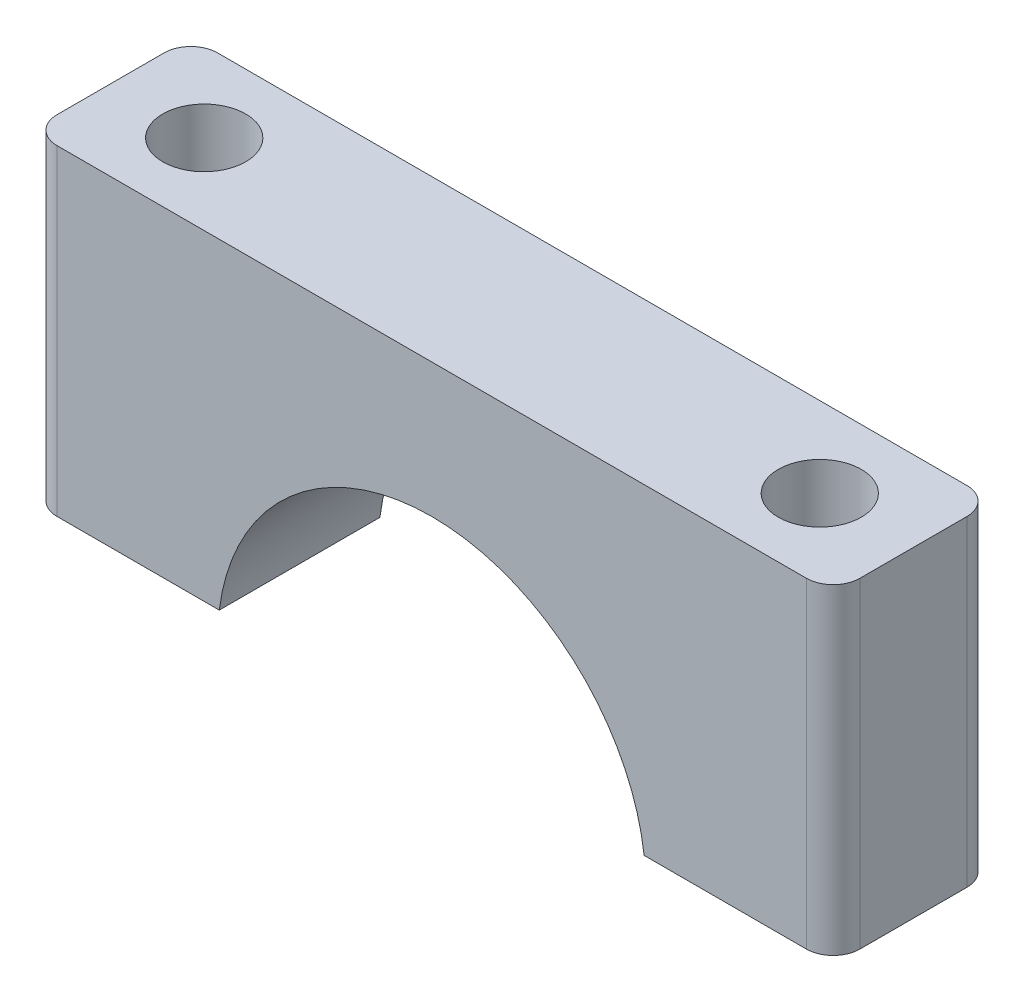
ISO-10303-21;
HEADER;
FILE_DESCRIPTION(('STEP AP214'),'2;1');
FILE_NAME('part.step','',(''),(''),'','','');
FILE_SCHEMA(('AUTOMOTIVE_DESIGN { 1 0 10303 214 1 1 1 1 }'));
ENDSEC;
DATA;
#1=APPLICATION_CONTEXT('core data for automotive mechanical design processes');
#2=APPLICATION_PROTOCOL_DEFINITION('international standard','automotive_design',2000,#1);
#3=PRODUCT_CONTEXT('',#1,'mechanical');
#4=PRODUCT('Part','Part','',(#3));
#5=PRODUCT_RELATED_PRODUCT_CATEGORY('part','',(#4));
#6=PRODUCT_DEFINITION_FORMATION('','',#4);
#7=PRODUCT_DEFINITION_CONTEXT('part definition',#1,'design');
#8=PRODUCT_DEFINITION('design','',#6,#7);
#9=PRODUCT_DEFINITION_SHAPE('','',#8);
#10=(LENGTH_UNIT() NAMED_UNIT(*) SI_UNIT(.MILLI.,.METRE.));
#11=(NAMED_UNIT(*) PLANE_ANGLE_UNIT() SI_UNIT($,.RADIAN.));
#12=(NAMED_UNIT(*) SI_UNIT($,.STERADIAN.) SOLID_ANGLE_UNIT());
#13=UNCERTAINTY_MEASURE_WITH_UNIT(LENGTH_MEASURE(1.E-05),#10,'distance_accuracy_value','');
#14=(GEOMETRIC_REPRESENTATION_CONTEXT(3) GLOBAL_UNCERTAINTY_ASSIGNED_CONTEXT((#13)) GLOBAL_UNIT_ASSIGNED_CONTEXT((#10,
#11,#12)) REPRESENTATION_CONTEXT('',''));
#15=CARTESIAN_POINT('',(0.,0.,0.));
#16=DIRECTION('',(0.,0.,1.));
#17=DIRECTION('',(1.,0.,0.));
#18=AXIS2_PLACEMENT_3D('',#15,#16,#17);
#19=CARTESIAN_POINT('',(-15.,-6.,6.));
#20=DIRECTION('',(0.,1.,0.));
#21=DIRECTION('',(0.,0.,1.));
#22=AXIS2_PLACEMENT_3D('',#19,#20,#21);
#23=PLANE('',#22);
#24=CARTESIAN_POINT('',(-11.5,-6.,3.));
#25=DIRECTION('',(0.,1.,0.));
#26=DIRECTION('',(0.,0.,1.));
#27=AXIS2_PLACEMENT_3D('',#24,#25,#26);
#28=CIRCLE('',#27,1.55);
#29=CARTESIAN_POINT('',(-11.5,-6.,4.55));
#30=VERTEX_POINT('',#29);
#31=EDGE_CURVE('E211',#30,#30,#28,.T.);
#32=ORIENTED_EDGE('',*,*,#31,.T.);
#33=EDGE_LOOP('',(#32));
#34=FACE_BOUND('',#33,.T.);
#35=DIRECTION('',(0.,0.,-1.));
#36=VECTOR('',#35,1.);
#37=CARTESIAN_POINT('',(-15.,-6.,6.));
#38=LINE('',#37,#36);
#39=CARTESIAN_POINT('',(-15.,-6.,5.));
#40=VERTEX_POINT('',#39);
#41=CARTESIAN_POINT('',(-15.,-6.,1.));
#42=VERTEX_POINT('',#41);
#43=EDGE_CURVE('E145',#40,#42,#38,.T.);
#44=ORIENTED_EDGE('',*,*,#43,.T.);
#45=CARTESIAN_POINT('',(-14.,-6.,1.));
#46=DIRECTION('',(0.,1.,0.));
#47=DIRECTION('',(0.,0.,1.));
#48=AXIS2_PLACEMENT_3D('',#45,#46,#47);
#49=CIRCLE('',#48,1.);
#50=CARTESIAN_POINT('',(-14.,-6.,0.));
#51=VERTEX_POINT('',#50);
#52=EDGE_CURVE('E11',#42,#51,#49,.F.);
#53=ORIENTED_EDGE('',*,*,#52,.T.);
#54=DIRECTION('',(1.,0.,0.));
#55=VECTOR('',#54,1.);
#56=CARTESIAN_POINT('',(-15.,-6.,0.));
#57=LINE('',#56,#55);
#58=CARTESIAN_POINT('',(-7.93725393319377,-6.,0.));
#59=VERTEX_POINT('',#58);
#60=EDGE_CURVE('E134',#51,#59,#57,.T.);
#61=ORIENTED_EDGE('',*,*,#60,.T.);
#62=DIRECTION('',(0.,0.,1.));
#63=VECTOR('',#62,1.);
#64=CARTESIAN_POINT('',(-7.93725393319377,-6.,0.));
#65=LINE('',#64,#63);
#66=CARTESIAN_POINT('',(-7.93725393319377,-6.,6.));
#67=VERTEX_POINT('',#66);
#68=EDGE_CURVE('E115',#59,#67,#65,.T.);
#69=ORIENTED_EDGE('',*,*,#68,.T.);
#70=DIRECTION('',(1.,0.,0.));
#71=VECTOR('',#70,1.);
#72=CARTESIAN_POINT('',(-15.,-6.,6.));
#73=LINE('',#72,#71);
#74=CARTESIAN_POINT('',(-14.,-6.,6.));
#75=VERTEX_POINT('',#74);
#76=EDGE_CURVE('E146',#75,#67,#73,.T.);
#77=ORIENTED_EDGE('',*,*,#76,.F.);
#78=CARTESIAN_POINT('',(-14.,-6.,5.));
#79=DIRECTION('',(0.,1.,0.));
#80=DIRECTION('',(0.,0.,1.));
#81=AXIS2_PLACEMENT_3D('',#78,#79,#80);
#82=CIRCLE('',#81,1.);
#83=EDGE_CURVE('E40',#75,#40,#82,.F.);
#84=ORIENTED_EDGE('',*,*,#83,.T.);
#85=EDGE_LOOP('',(#44,#53,#61,#69,#77,#84));
#86=FACE_BOUND('',#85,.T.);
#87=ADVANCED_FACE('F32',(#34,#86),#23,.F.);
#88=CARTESIAN_POINT('',(15.,-6.,6.));
#89=DIRECTION('',(-1.,0.,0.));
#90=DIRECTION('',(0.,0.,1.));
#91=AXIS2_PLACEMENT_3D('',#88,#89,#90);
#92=PLANE('',#91);
#93=DIRECTION('',(0.,0.,-1.));
#94=VECTOR('',#93,1.);
#95=CARTESIAN_POINT('',(15.,-6.,6.));
#96=LINE('',#95,#94);
#97=CARTESIAN_POINT('',(15.,-6.,5.));
#98=VERTEX_POINT('',#97);
#99=CARTESIAN_POINT('',(15.,-6.,1.));
#100=VERTEX_POINT('',#99);
#101=EDGE_CURVE('E142',#98,#100,#96,.T.);
#102=ORIENTED_EDGE('',*,*,#101,.T.);
#103=DIRECTION('',(0.,1.,0.));
#104=VECTOR('',#103,1.);
#105=CARTESIAN_POINT('',(15.,6.,1.));
#106=LINE('',#105,#104);
#107=CARTESIAN_POINT('',(15.,6.,1.));
#108=VERTEX_POINT('',#107);
#109=EDGE_CURVE('E156',#100,#108,#106,.T.);
#110=ORIENTED_EDGE('',*,*,#109,.T.);
#111=DIRECTION('',(0.,0.,-1.));
#112=VECTOR('',#111,1.);
#113=CARTESIAN_POINT('',(15.,6.,6.));
#114=LINE('',#113,#112);
#115=CARTESIAN_POINT('',(15.,6.,5.));
#116=VERTEX_POINT('',#115);
#117=EDGE_CURVE('E151',#116,#108,#114,.T.);
#118=ORIENTED_EDGE('',*,*,#117,.F.);
#119=DIRECTION('',(0.,1.,0.));
#120=VECTOR('',#119,1.);
#121=CARTESIAN_POINT('',(15.,-6.,5.));
#122=LINE('',#121,#120);
#123=EDGE_CURVE('E154',#116,#98,#122,.F.);
#124=ORIENTED_EDGE('',*,*,#123,.T.);
#125=EDGE_LOOP('',(#102,#110,#118,#124));
#126=FACE_BOUND('',#125,.T.);
#127=ADVANCED_FACE('F198',(#126),#92,.F.);
#128=CARTESIAN_POINT('',(-15.,6.,6.));
#129=DIRECTION('',(0.,-1.,0.));
#130=DIRECTION('',(0.,0.,-1.));
#131=AXIS2_PLACEMENT_3D('',#128,#129,#130);
#132=PLANE('',#131);
#133=CARTESIAN_POINT('',(11.5,6.,3.));
#134=DIRECTION('',(0.,1.,0.));
#135=DIRECTION('',(0.,0.,1.));
#136=AXIS2_PLACEMENT_3D('',#133,#134,#135);
#137=CIRCLE('',#136,1.55);
#138=CARTESIAN_POINT('',(11.5,6.,4.55));
#139=VERTEX_POINT('',#138);
#140=EDGE_CURVE('E219',#139,#139,#137,.T.);
#141=ORIENTED_EDGE('',*,*,#140,.F.);
#142=EDGE_LOOP('',(#141));
#143=FACE_BOUND('',#142,.T.);
#144=CARTESIAN_POINT('',(-11.5,6.,3.));
#145=DIRECTION('',(0.,1.,0.));
#146=DIRECTION('',(0.,0.,1.));
#147=AXIS2_PLACEMENT_3D('',#144,#145,#146);
#148=CIRCLE('',#147,1.55);
#149=CARTESIAN_POINT('',(-11.5,6.,4.55));
#150=VERTEX_POINT('',#149);
#151=EDGE_CURVE('E213',#150,#150,#148,.T.);
#152=ORIENTED_EDGE('',*,*,#151,.F.);
#153=EDGE_LOOP('',(#152));
#154=FACE_BOUND('',#153,.T.);
#155=ORIENTED_EDGE('',*,*,#117,.T.);
#156=CARTESIAN_POINT('',(14.,6.,1.));
#157=DIRECTION('',(0.,-1.,0.));
#158=DIRECTION('',(0.,0.,-1.));
#159=AXIS2_PLACEMENT_3D('',#156,#157,#158);
#160=CIRCLE('',#159,1.);
#161=CARTESIAN_POINT('',(14.,6.,0.));
#162=VERTEX_POINT('',#161);
#163=EDGE_CURVE('E165',#108,#162,#160,.F.);
#164=ORIENTED_EDGE('',*,*,#163,.T.);
#165=DIRECTION('',(-1.,0.,0.));
#166=VECTOR('',#165,1.);
#167=CARTESIAN_POINT('',(-15.,6.,0.));
#168=LINE('',#167,#166);
#169=CARTESIAN_POINT('',(-14.,6.,0.));
#170=VERTEX_POINT('',#169);
#171=EDGE_CURVE('E135',#162,#170,#168,.T.);
#172=ORIENTED_EDGE('',*,*,#171,.T.);
#173=CARTESIAN_POINT('',(-14.,6.,1.));
#174=DIRECTION('',(0.,-1.,0.));
#175=DIRECTION('',(0.,0.,-1.));
#176=AXIS2_PLACEMENT_3D('',#173,#174,#175);
#177=CIRCLE('',#176,1.);
#178=CARTESIAN_POINT('',(-15.,6.,1.));
#179=VERTEX_POINT('',#178);
#180=EDGE_CURVE('E161',#170,#179,#177,.F.);
#181=ORIENTED_EDGE('',*,*,#180,.T.);
#182=DIRECTION('',(0.,0.,-1.));
#183=VECTOR('',#182,1.);
#184=CARTESIAN_POINT('',(-15.,6.,6.));
#185=LINE('',#184,#183);
#186=CARTESIAN_POINT('',(-15.,6.,5.));
#187=VERTEX_POINT('',#186);
#188=EDGE_CURVE('E148',#187,#179,#185,.T.);
#189=ORIENTED_EDGE('',*,*,#188,.F.);
#190=CARTESIAN_POINT('',(-14.,6.,5.));
#191=DIRECTION('',(0.,-1.,0.));
#192=DIRECTION('',(0.,0.,-1.));
#193=AXIS2_PLACEMENT_3D('',#190,#191,#192);
#194=CIRCLE('',#193,1.);
#195=CARTESIAN_POINT('',(-14.,6.,6.));
#196=VERTEX_POINT('',#195);
#197=EDGE_CURVE('E159',#187,#196,#194,.F.);
#198=ORIENTED_EDGE('',*,*,#197,.T.);
#199=DIRECTION('',(-1.,0.,0.));
#200=VECTOR('',#199,1.);
#201=CARTESIAN_POINT('',(-15.,6.,6.));
#202=LINE('',#201,#200);
#203=CARTESIAN_POINT('',(14.,6.,6.));
#204=VERTEX_POINT('',#203);
#205=EDGE_CURVE('E137',#204,#196,#202,.T.);
#206=ORIENTED_EDGE('',*,*,#205,.F.);
#207=CARTESIAN_POINT('',(14.,6.,5.));
#208=DIRECTION('',(0.,-1.,0.));
#209=DIRECTION('',(0.,0.,-1.));
#210=AXIS2_PLACEMENT_3D('',#207,#208,#209);
#211=CIRCLE('',#210,1.);
#212=EDGE_CURVE('E163',#204,#116,#211,.F.);
#213=ORIENTED_EDGE('',*,*,#212,.T.);
#214=EDGE_LOOP('',(#155,#164,#172,#181,#189,#198,#206,#213));
#215=FACE_BOUND('',#214,.T.);
#216=ADVANCED_FACE('F190',(#143,#154,#215),#132,.F.);
#217=CARTESIAN_POINT('',(-15.,-6.,6.));
#218=DIRECTION('',(1.,0.,0.));
#219=DIRECTION('',(0.,0.,-1.));
#220=AXIS2_PLACEMENT_3D('',#217,#218,#219);
#221=PLANE('',#220);
#222=ORIENTED_EDGE('',*,*,#188,.T.);
#223=DIRECTION('',(0.,-1.,0.));
#224=VECTOR('',#223,1.);
#225=CARTESIAN_POINT('',(-15.,-6.,1.));
#226=LINE('',#225,#224);
#227=EDGE_CURVE('E182',#179,#42,#226,.T.);
#228=ORIENTED_EDGE('',*,*,#227,.T.);
#229=ORIENTED_EDGE('',*,*,#43,.F.);
#230=DIRECTION('',(0.,-1.,0.));
#231=VECTOR('',#230,1.);
#232=CARTESIAN_POINT('',(-15.,-6.,5.));
#233=LINE('',#232,#231);
#234=EDGE_CURVE('E180',#40,#187,#233,.F.);
#235=ORIENTED_EDGE('',*,*,#234,.T.);
#236=EDGE_LOOP('',(#222,#228,#229,#235));
#237=FACE_BOUND('',#236,.T.);
#238=ADVANCED_FACE('F184',(#237),#221,.F.);
#239=CARTESIAN_POINT('',(11.5,-6.,3.));
#240=DIRECTION('',(0.,1.,0.));
#241=DIRECTION('',(0.,0.,1.));
#242=AXIS2_PLACEMENT_3D('',#239,#240,#241);
#243=CIRCLE('',#242,1.55);
#244=CARTESIAN_POINT('',(11.5,-6.,4.55));
#245=VERTEX_POINT('',#244);
#246=EDGE_CURVE('E216',#245,#245,#243,.T.);
#247=ORIENTED_EDGE('',*,*,#246,.T.);
#248=EDGE_LOOP('',(#247));
#249=FACE_BOUND('',#248,.T.);
#250=CARTESIAN_POINT('',(7.93725393319377,-6.,0.));
#251=VERTEX_POINT('',#250);
#252=CARTESIAN_POINT('',(14.,-6.,0.));
#253=VERTEX_POINT('',#252);
#254=EDGE_CURVE('E125',#251,#253,#57,.T.);
#255=ORIENTED_EDGE('',*,*,#254,.T.);
#256=CARTESIAN_POINT('',(14.,-6.,1.));
#257=DIRECTION('',(0.,1.,0.));
#258=DIRECTION('',(0.,0.,1.));
#259=AXIS2_PLACEMENT_3D('',#256,#257,#258);
#260=CIRCLE('',#259,1.);
#261=EDGE_CURVE('E172',#253,#100,#260,.F.);
#262=ORIENTED_EDGE('',*,*,#261,.T.);
#263=ORIENTED_EDGE('',*,*,#101,.F.);
#264=CARTESIAN_POINT('',(14.,-6.,5.));
#265=DIRECTION('',(0.,1.,0.));
#266=DIRECTION('',(0.,0.,1.));
#267=AXIS2_PLACEMENT_3D('',#264,#265,#266);
#268=CIRCLE('',#267,1.);
#269=CARTESIAN_POINT('',(14.,-6.,6.));
#270=VERTEX_POINT('',#269);
#271=EDGE_CURVE('E170',#98,#270,#268,.F.);
#272=ORIENTED_EDGE('',*,*,#271,.T.);
#273=CARTESIAN_POINT('',(7.93725393319377,-6.,6.));
#274=VERTEX_POINT('',#273);
#275=EDGE_CURVE('E128',#274,#270,#73,.T.);
#276=ORIENTED_EDGE('',*,*,#275,.F.);
#277=DIRECTION('',(0.,0.,1.));
#278=VECTOR('',#277,1.);
#279=CARTESIAN_POINT('',(7.93725393319377,-6.,0.));
#280=LINE('',#279,#278);
#281=EDGE_CURVE('E112',#274,#251,#280,.F.);
#282=ORIENTED_EDGE('',*,*,#281,.T.);
#283=EDGE_LOOP('',(#255,#262,#263,#272,#276,#282));
#284=FACE_BOUND('',#283,.T.);
#285=ADVANCED_FACE('F124',(#249,#284),#23,.F.);
#286=CARTESIAN_POINT('',(0.,0.,6.));
#287=DIRECTION('',(0.,0.,-1.));
#288=DIRECTION('',(-1.,0.,0.));
#289=AXIS2_PLACEMENT_3D('',#286,#287,#288);
#290=PLANE('',#289);
#291=ORIENTED_EDGE('',*,*,#275,.T.);
#292=DIRECTION('',(0.,1.,0.));
#293=VECTOR('',#292,1.);
#294=CARTESIAN_POINT('',(14.,0.,6.));
#295=LINE('',#294,#293);
#296=EDGE_CURVE('E177',#270,#204,#295,.T.);
#297=ORIENTED_EDGE('',*,*,#296,.T.);
#298=ORIENTED_EDGE('',*,*,#205,.T.);
#299=DIRECTION('',(0.,-1.,0.));
#300=VECTOR('',#299,1.);
#301=CARTESIAN_POINT('',(-14.,0.,6.));
#302=LINE('',#301,#300);
#303=EDGE_CURVE('E174',#196,#75,#302,.T.);
#304=ORIENTED_EDGE('',*,*,#303,.T.);
#305=ORIENTED_EDGE('',*,*,#76,.T.);
#306=CARTESIAN_POINT('',(0.,-7.,6.));
#307=DIRECTION('',(0.,0.,1.));
#308=DIRECTION('',(1.,0.,0.));
#309=AXIS2_PLACEMENT_3D('',#306,#307,#308);
#310=CIRCLE('',#309,8.);
#311=EDGE_CURVE('E119',#274,#67,#310,.T.);
#312=ORIENTED_EDGE('',*,*,#311,.F.);
#313=EDGE_LOOP('',(#291,#297,#298,#304,#305,#312));
#314=FACE_BOUND('',#313,.T.);
#315=ADVANCED_FACE('F205',(#314),#290,.F.);
#316=CARTESIAN_POINT('',(0.,0.,0.));
#317=DIRECTION('',(0.,0.,-1.));
#318=DIRECTION('',(-1.,0.,0.));
#319=AXIS2_PLACEMENT_3D('',#316,#317,#318);
#320=PLANE('',#319);
#321=ORIENTED_EDGE('',*,*,#171,.F.);
#322=DIRECTION('',(0.,1.,0.));
#323=VECTOR('',#322,1.);
#324=CARTESIAN_POINT('',(14.,-6.,0.));
#325=LINE('',#324,#323);
#326=EDGE_CURVE('E133',#162,#253,#325,.F.);
#327=ORIENTED_EDGE('',*,*,#326,.T.);
#328=ORIENTED_EDGE('',*,*,#254,.F.);
#329=CARTESIAN_POINT('',(0.,-7.,0.));
#330=DIRECTION('',(0.,0.,1.));
#331=DIRECTION('',(1.,0.,0.));
#332=AXIS2_PLACEMENT_3D('',#329,#330,#331);
#333=CIRCLE('',#332,8.);
#334=EDGE_CURVE('E108',#251,#59,#333,.T.);
#335=ORIENTED_EDGE('',*,*,#334,.T.);
#336=ORIENTED_EDGE('',*,*,#60,.F.);
#337=DIRECTION('',(0.,-1.,0.));
#338=VECTOR('',#337,1.);
#339=CARTESIAN_POINT('',(-14.,6.,0.));
#340=LINE('',#339,#338);
#341=EDGE_CURVE('E167',#51,#170,#340,.F.);
#342=ORIENTED_EDGE('',*,*,#341,.T.);
#343=EDGE_LOOP('',(#321,#327,#328,#335,#336,#342));
#344=FACE_BOUND('',#343,.T.);
#345=ADVANCED_FACE('F131',(#344),#320,.T.);
#346=CARTESIAN_POINT('',(0.,-7.,0.));
#347=DIRECTION('',(0.,0.,1.));
#348=DIRECTION('',(1.,0.,0.));
#349=AXIS2_PLACEMENT_3D('',#346,#347,#348);
#350=CYLINDRICAL_SURFACE('',#349,8.);
#351=ORIENTED_EDGE('',*,*,#334,.F.);
#352=ORIENTED_EDGE('',*,*,#281,.F.);
#353=ORIENTED_EDGE('',*,*,#311,.T.);
#354=ORIENTED_EDGE('',*,*,#68,.F.);
#355=EDGE_LOOP('',(#351,#352,#353,#354));
#356=FACE_BOUND('',#355,.T.);
#357=ADVANCED_FACE('F110',(#356),#350,.F.);
#358=CARTESIAN_POINT('',(-11.5,-6.,3.));
#359=DIRECTION('',(0.,1.,0.));
#360=DIRECTION('',(0.,0.,1.));
#361=AXIS2_PLACEMENT_3D('',#358,#359,#360);
#362=CYLINDRICAL_SURFACE('',#361,1.55);
#363=ORIENTED_EDGE('',*,*,#31,.F.);
#364=EDGE_LOOP('',(#363));
#365=FACE_BOUND('',#364,.T.);
#366=ORIENTED_EDGE('',*,*,#151,.T.);
#367=EDGE_LOOP('',(#366));
#368=FACE_BOUND('',#367,.T.);
#369=ADVANCED_FACE('F229',(#365,#368),#362,.F.);
#370=CARTESIAN_POINT('',(11.5,-6.,3.));
#371=DIRECTION('',(0.,1.,0.));
#372=DIRECTION('',(0.,0.,1.));
#373=AXIS2_PLACEMENT_3D('',#370,#371,#372);
#374=CYLINDRICAL_SURFACE('',#373,1.55);
#375=ORIENTED_EDGE('',*,*,#246,.F.);
#376=EDGE_LOOP('',(#375));
#377=FACE_BOUND('',#376,.T.);
#378=ORIENTED_EDGE('',*,*,#140,.T.);
#379=EDGE_LOOP('',(#378));
#380=FACE_BOUND('',#379,.T.);
#381=ADVANCED_FACE('F226',(#377,#380),#374,.F.);
#382=CARTESIAN_POINT('',(14.,-6.,1.));
#383=DIRECTION('',(0.,-1.,0.));
#384=DIRECTION('',(0.,0.,-1.));
#385=AXIS2_PLACEMENT_3D('',#382,#383,#384);
#386=CYLINDRICAL_SURFACE('',#385,1.);
#387=ORIENTED_EDGE('',*,*,#261,.F.);
#388=ORIENTED_EDGE('',*,*,#326,.F.);
#389=ORIENTED_EDGE('',*,*,#163,.F.);
#390=ORIENTED_EDGE('',*,*,#109,.F.);
#391=EDGE_LOOP('',(#387,#388,#389,#390));
#392=FACE_BOUND('',#391,.T.);
#393=ADVANCED_FACE('F193',(#392),#386,.T.);
#394=CARTESIAN_POINT('',(14.,0.,5.));
#395=DIRECTION('',(0.,1.,0.));
#396=DIRECTION('',(0.,0.,1.));
#397=AXIS2_PLACEMENT_3D('',#394,#395,#396);
#398=CYLINDRICAL_SURFACE('',#397,1.);
#399=ORIENTED_EDGE('',*,*,#271,.F.);
#400=ORIENTED_EDGE('',*,*,#123,.F.);
#401=ORIENTED_EDGE('',*,*,#212,.F.);
#402=ORIENTED_EDGE('',*,*,#296,.F.);
#403=EDGE_LOOP('',(#399,#400,#401,#402));
#404=FACE_BOUND('',#403,.T.);
#405=ADVANCED_FACE('F202',(#404),#398,.T.);
#406=CARTESIAN_POINT('',(-14.,-6.,1.));
#407=DIRECTION('',(0.,1.,0.));
#408=DIRECTION('',(0.,0.,1.));
#409=AXIS2_PLACEMENT_3D('',#406,#407,#408);
#410=CYLINDRICAL_SURFACE('',#409,1.);
#411=ORIENTED_EDGE('',*,*,#180,.F.);
#412=ORIENTED_EDGE('',*,*,#341,.F.);
#413=ORIENTED_EDGE('',*,*,#52,.F.);
#414=ORIENTED_EDGE('',*,*,#227,.F.);
#415=EDGE_LOOP('',(#411,#412,#413,#414));
#416=FACE_BOUND('',#415,.T.);
#417=ADVANCED_FACE('F188',(#416),#410,.T.);
#418=CARTESIAN_POINT('',(-14.,0.,5.));
#419=DIRECTION('',(0.,-1.,0.));
#420=DIRECTION('',(0.,0.,-1.));
#421=AXIS2_PLACEMENT_3D('',#418,#419,#420);
#422=CYLINDRICAL_SURFACE('',#421,1.);
#423=ORIENTED_EDGE('',*,*,#197,.F.);
#424=ORIENTED_EDGE('',*,*,#234,.F.);
#425=ORIENTED_EDGE('',*,*,#83,.F.);
#426=ORIENTED_EDGE('',*,*,#303,.F.);
#427=EDGE_LOOP('',(#423,#424,#425,#426));
#428=FACE_BOUND('',#427,.T.);
#429=ADVANCED_FACE('F34',(#428),#422,.T.);
#430=CLOSED_SHELL('',(#87,#127,#216,#238,#285,#315,#345,#357,#369,#381,#393,#405,#417,#429));
#431=MANIFOLD_SOLID_BREP('B2',#430);
#432=ADVANCED_BREP_SHAPE_REPRESENTATION('',(#18,#431),#14);
#433=SHAPE_DEFINITION_REPRESENTATION(#9,#432);
ENDSEC;
END-ISO-10303-21;
